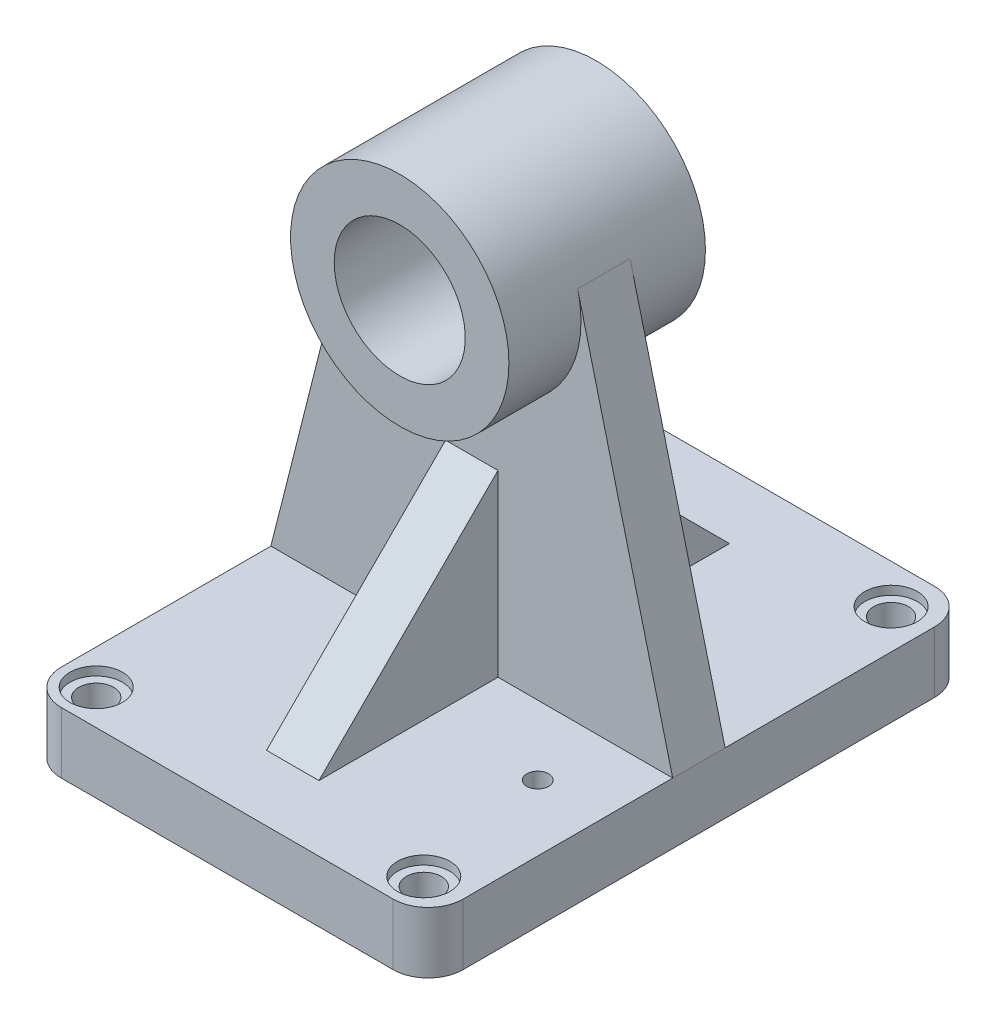
ISO-10303-21;
HEADER;
FILE_DESCRIPTION(('STEP AP214'),'2;1');
FILE_NAME('part.step','',(''),(''),'','','');
FILE_SCHEMA(('AUTOMOTIVE_DESIGN { 1 0 10303 214 1 1 1 1 }'));
ENDSEC;
DATA;
#1=APPLICATION_CONTEXT('core data for automotive mechanical design processes');
#2=APPLICATION_PROTOCOL_DEFINITION('international standard','automotive_design',2000,#1);
#3=PRODUCT_CONTEXT('',#1,'mechanical');
#4=PRODUCT('Part','Part','',(#3));
#5=PRODUCT_RELATED_PRODUCT_CATEGORY('part','',(#4));
#6=PRODUCT_DEFINITION_FORMATION('','',#4);
#7=PRODUCT_DEFINITION_CONTEXT('part definition',#1,'design');
#8=PRODUCT_DEFINITION('design','',#6,#7);
#9=PRODUCT_DEFINITION_SHAPE('','',#8);
#10=(LENGTH_UNIT() NAMED_UNIT(*) SI_UNIT(.MILLI.,.METRE.));
#11=(NAMED_UNIT(*) PLANE_ANGLE_UNIT() SI_UNIT($,.RADIAN.));
#12=(NAMED_UNIT(*) SI_UNIT($,.STERADIAN.) SOLID_ANGLE_UNIT());
#13=UNCERTAINTY_MEASURE_WITH_UNIT(LENGTH_MEASURE(1.E-05),#10,'distance_accuracy_value','');
#14=(GEOMETRIC_REPRESENTATION_CONTEXT(3) GLOBAL_UNCERTAINTY_ASSIGNED_CONTEXT((#13)) GLOBAL_UNIT_ASSIGNED_CONTEXT((#10,
#11,#12)) REPRESENTATION_CONTEXT('',''));
#15=CARTESIAN_POINT('',(0.,0.,0.));
#16=DIRECTION('',(0.,0.,1.));
#17=DIRECTION('',(1.,0.,0.));
#18=AXIS2_PLACEMENT_3D('',#15,#16,#17);
#19=CARTESIAN_POINT('',(-46.,-94.,-62.));
#20=DIRECTION('',(0.,-1.,0.));
#21=DIRECTION('',(0.,0.,-1.));
#22=AXIS2_PLACEMENT_3D('',#19,#20,#21);
#23=PLANE('',#22);
#24=CARTESIAN_POINT('',(37.,-94.,-53.));
#25=DIRECTION('',(0.,1.,0.));
#26=DIRECTION('',(0.,0.,1.));
#27=AXIS2_PLACEMENT_3D('',#24,#25,#26);
#28=CIRCLE('',#27,4.);
#29=CARTESIAN_POINT('',(37.,-94.,-49.));
#30=VERTEX_POINT('',#29);
#31=EDGE_CURVE('E761',#30,#30,#28,.T.);
#32=ORIENTED_EDGE('',*,*,#31,.T.);
#33=EDGE_LOOP('',(#32));
#34=FACE_BOUND('',#33,.T.);
#35=DIRECTION('',(0.,0.,1.));
#36=VECTOR('',#35,1.);
#37=CARTESIAN_POINT('',(-46.,-94.,-62.));
#38=LINE('',#37,#36);
#39=CARTESIAN_POINT('',(-46.,-94.,-54.));
#40=VERTEX_POINT('',#39);
#41=CARTESIAN_POINT('',(-46.,-94.,54.));
#42=VERTEX_POINT('',#41);
#43=EDGE_CURVE('E255',#40,#42,#38,.T.);
#44=ORIENTED_EDGE('',*,*,#43,.F.);
#45=CARTESIAN_POINT('',(-38.,-94.,-54.));
#46=DIRECTION('',(0.,-1.,0.));
#47=DIRECTION('',(0.,0.,-1.));
#48=AXIS2_PLACEMENT_3D('',#45,#46,#47);
#49=CIRCLE('',#48,8.);
#50=CARTESIAN_POINT('',(-38.,-94.,-62.));
#51=VERTEX_POINT('',#50);
#52=EDGE_CURVE('E347',#40,#51,#49,.T.);
#53=ORIENTED_EDGE('',*,*,#52,.T.);
#54=DIRECTION('',(1.,0.,0.));
#55=VECTOR('',#54,1.);
#56=CARTESIAN_POINT('',(-46.,-94.,-62.));
#57=LINE('',#56,#55);
#58=CARTESIAN_POINT('',(38.,-94.,-62.));
#59=VERTEX_POINT('',#58);
#60=EDGE_CURVE('E246',#51,#59,#57,.T.);
#61=ORIENTED_EDGE('',*,*,#60,.T.);
#62=CARTESIAN_POINT('',(38.,-94.,-54.));
#63=DIRECTION('',(0.,-1.,0.));
#64=DIRECTION('',(0.,0.,-1.));
#65=AXIS2_PLACEMENT_3D('',#62,#63,#64);
#66=CIRCLE('',#65,8.);
#67=CARTESIAN_POINT('',(46.,-94.,-54.));
#68=VERTEX_POINT('',#67);
#69=EDGE_CURVE('E344',#59,#68,#66,.T.);
#70=ORIENTED_EDGE('',*,*,#69,.T.);
#71=DIRECTION('',(0.,0.,1.));
#72=VECTOR('',#71,1.);
#73=CARTESIAN_POINT('',(46.,-94.,-62.));
#74=LINE('',#73,#72);
#75=CARTESIAN_POINT('',(46.,-94.,54.));
#76=VERTEX_POINT('',#75);
#77=EDGE_CURVE('E268',#68,#76,#74,.T.);
#78=ORIENTED_EDGE('',*,*,#77,.T.);
#79=CARTESIAN_POINT('',(38.,-94.,54.));
#80=DIRECTION('',(0.,-1.,0.));
#81=DIRECTION('',(0.,0.,-1.));
#82=AXIS2_PLACEMENT_3D('',#79,#80,#81);
#83=CIRCLE('',#82,8.);
#84=CARTESIAN_POINT('',(38.,-94.,62.));
#85=VERTEX_POINT('',#84);
#86=EDGE_CURVE('E341',#76,#85,#83,.T.);
#87=ORIENTED_EDGE('',*,*,#86,.T.);
#88=DIRECTION('',(1.,0.,0.));
#89=VECTOR('',#88,1.);
#90=CARTESIAN_POINT('',(-46.,-94.,62.));
#91=LINE('',#90,#89);
#92=CARTESIAN_POINT('',(-38.,-94.,62.));
#93=VERTEX_POINT('',#92);
#94=EDGE_CURVE('E245',#93,#85,#91,.T.);
#95=ORIENTED_EDGE('',*,*,#94,.F.);
#96=CARTESIAN_POINT('',(-38.,-94.,54.));
#97=DIRECTION('',(0.,-1.,0.));
#98=DIRECTION('',(0.,0.,-1.));
#99=AXIS2_PLACEMENT_3D('',#96,#97,#98);
#100=CIRCLE('',#99,8.);
#101=EDGE_CURVE('E338',#93,#42,#100,.T.);
#102=ORIENTED_EDGE('',*,*,#101,.T.);
#103=EDGE_LOOP('',(#44,#53,#61,#70,#78,#87,#95,#102));
#104=FACE_BOUND('',#103,.T.);
#105=CARTESIAN_POINT('',(-38.,-94.,54.));
#106=DIRECTION('',(0.,1.,0.));
#107=DIRECTION('',(0.,0.,1.));
#108=AXIS2_PLACEMENT_3D('',#105,#106,#107);
#109=CIRCLE('',#108,4.);
#110=CARTESIAN_POINT('',(-38.,-94.,58.));
#111=VERTEX_POINT('',#110);
#112=EDGE_CURVE('E517',#111,#111,#109,.T.);
#113=ORIENTED_EDGE('',*,*,#112,.T.);
#114=EDGE_LOOP('',(#113));
#115=FACE_BOUND('',#114,.T.);
#116=CARTESIAN_POINT('',(30.9432382564792,-94.,21.8439501733275));
#117=DIRECTION('',(0.,1.,0.));
#118=DIRECTION('',(0.,0.,1.));
#119=AXIS2_PLACEMENT_3D('',#116,#117,#118);
#120=CIRCLE('',#119,2.5);
#121=CARTESIAN_POINT('',(30.9432382564792,-94.,24.3439501733275));
#122=VERTEX_POINT('',#121);
#123=EDGE_CURVE('E503',#122,#122,#120,.T.);
#124=ORIENTED_EDGE('',*,*,#123,.T.);
#125=EDGE_LOOP('',(#124));
#126=FACE_BOUND('',#125,.T.);
#127=CARTESIAN_POINT('',(-38.,-94.,-53.));
#128=DIRECTION('',(0.,1.,0.));
#129=DIRECTION('',(0.,0.,1.));
#130=AXIS2_PLACEMENT_3D('',#127,#128,#129);
#131=CIRCLE('',#130,4.);
#132=CARTESIAN_POINT('',(-38.,-94.,-49.));
#133=VERTEX_POINT('',#132);
#134=EDGE_CURVE('E790',#133,#133,#131,.T.);
#135=ORIENTED_EDGE('',*,*,#134,.T.);
#136=EDGE_LOOP('',(#135));
#137=FACE_BOUND('',#136,.T.);
#138=CARTESIAN_POINT('',(37.,-94.,54.));
#139=DIRECTION('',(0.,1.,0.));
#140=DIRECTION('',(0.,0.,1.));
#141=AXIS2_PLACEMENT_3D('',#138,#139,#140);
#142=CIRCLE('',#141,4.);
#143=CARTESIAN_POINT('',(37.,-94.,58.));
#144=VERTEX_POINT('',#143);
#145=EDGE_CURVE('E774',#144,#144,#142,.T.);
#146=ORIENTED_EDGE('',*,*,#145,.T.);
#147=EDGE_LOOP('',(#146));
#148=FACE_BOUND('',#147,.T.);
#149=ADVANCED_FACE('F43',(#34,#104,#115,#126,#137,#148),#23,.T.);
#150=CARTESIAN_POINT('',(0.,0.,22.5));
#151=DIRECTION('',(0.,0.,1.));
#152=DIRECTION('',(1.,0.,0.));
#153=AXIS2_PLACEMENT_3D('',#150,#151,#152);
#154=PLANE('',#153);
#155=CARTESIAN_POINT('',(0.,0.,22.5));
#156=DIRECTION('',(0.,0.,1.));
#157=DIRECTION('',(1.,0.,0.));
#158=AXIS2_PLACEMENT_3D('',#155,#156,#157);
#159=CIRCLE('',#158,15.);
#160=CARTESIAN_POINT('',(-15.,0.,22.5));
#161=VERTEX_POINT('',#160);
#162=EDGE_CURVE('E316',#161,#161,#159,.T.);
#163=ORIENTED_EDGE('',*,*,#162,.F.);
#164=EDGE_LOOP('',(#163));
#165=FACE_BOUND('',#164,.T.);
#166=CARTESIAN_POINT('',(0.,0.,22.5));
#167=DIRECTION('',(0.,0.,1.));
#168=DIRECTION('',(1.,0.,0.));
#169=AXIS2_PLACEMENT_3D('',#166,#167,#168);
#170=CIRCLE('',#169,25.);
#171=CARTESIAN_POINT('',(25.,0.,22.5));
#172=VERTEX_POINT('',#171);
#173=EDGE_CURVE('E324',#172,#172,#170,.T.);
#174=ORIENTED_EDGE('',*,*,#173,.T.);
#175=EDGE_LOOP('',(#174));
#176=FACE_BOUND('',#175,.T.);
#177=ADVANCED_FACE('F457',(#165,#176),#154,.T.);
#178=CARTESIAN_POINT('',(0.,0.,-22.5));
#179=DIRECTION('',(0.,0.,1.));
#180=DIRECTION('',(1.,0.,0.));
#181=AXIS2_PLACEMENT_3D('',#178,#179,#180);
#182=PLANE('',#181);
#183=CARTESIAN_POINT('',(0.,0.,-22.5));
#184=DIRECTION('',(0.,0.,1.));
#185=DIRECTION('',(1.,0.,0.));
#186=AXIS2_PLACEMENT_3D('',#183,#184,#185);
#187=CIRCLE('',#186,15.);
#188=CARTESIAN_POINT('',(-15.,0.,-22.5));
#189=VERTEX_POINT('',#188);
#190=EDGE_CURVE('E315',#189,#189,#187,.T.);
#191=ORIENTED_EDGE('',*,*,#190,.T.);
#192=EDGE_LOOP('',(#191));
#193=FACE_BOUND('',#192,.T.);
#194=CARTESIAN_POINT('',(0.,0.,-22.5));
#195=DIRECTION('',(0.,0.,1.));
#196=DIRECTION('',(1.,0.,0.));
#197=AXIS2_PLACEMENT_3D('',#194,#195,#196);
#198=CIRCLE('',#197,25.);
#199=CARTESIAN_POINT('',(25.,0.,-22.5));
#200=VERTEX_POINT('',#199);
#201=EDGE_CURVE('E320',#200,#200,#198,.T.);
#202=ORIENTED_EDGE('',*,*,#201,.F.);
#203=EDGE_LOOP('',(#202));
#204=FACE_BOUND('',#203,.T.);
#205=ADVANCED_FACE('F463',(#193,#204),#182,.F.);
#206=CARTESIAN_POINT('',(0.,0.,22.5));
#207=DIRECTION('',(0.,0.,-1.));
#208=DIRECTION('',(-1.,0.,0.));
#209=AXIS2_PLACEMENT_3D('',#206,#207,#208);
#210=CYLINDRICAL_SURFACE('',#209,25.);
#211=ORIENTED_EDGE('',*,*,#201,.T.);
#212=EDGE_LOOP('',(#211));
#213=FACE_BOUND('',#212,.T.);
#214=DIRECTION('',(0.,0.,-1.));
#215=VECTOR('',#214,1.);
#216=CARTESIAN_POINT('',(-24.2382106129064,6.12447110242117,6.));
#217=LINE('',#216,#215);
#218=CARTESIAN_POINT('',(-24.2382106129064,6.12447110242118,6.00000000000001));
#219=VERTEX_POINT('',#218);
#220=CARTESIAN_POINT('',(-24.2382106129064,6.12447110242117,-6.));
#221=VERTEX_POINT('',#220);
#222=EDGE_CURVE('E311',#219,#221,#217,.T.);
#223=ORIENTED_EDGE('',*,*,#222,.F.);
#224=CARTESIAN_POINT('',(0.,0.,6.));
#225=DIRECTION('',(0.,0.,-1.));
#226=DIRECTION('',(1.,0.,0.));
#227=AXIS2_PLACEMENT_3D('',#224,#225,#226);
#228=CIRCLE('',#227,25.);
#229=CARTESIAN_POINT('',(24.2382106129064,6.12447110242118,6.00000000000001));
#230=VERTEX_POINT('',#229);
#231=EDGE_CURVE('E275',#230,#219,#228,.T.);
#232=ORIENTED_EDGE('',*,*,#231,.F.);
#233=DIRECTION('',(0.,0.,-1.));
#234=VECTOR('',#233,1.);
#235=CARTESIAN_POINT('',(24.2382106129064,6.12447110242117,6.));
#236=LINE('',#235,#234);
#237=CARTESIAN_POINT('',(24.2382106129064,6.12447110242117,-6.));
#238=VERTEX_POINT('',#237);
#239=EDGE_CURVE('E292',#230,#238,#236,.T.);
#240=ORIENTED_EDGE('',*,*,#239,.T.);
#241=CARTESIAN_POINT('',(0.,0.,-6.));
#242=DIRECTION('',(0.,0.,-1.));
#243=DIRECTION('',(1.,0.,0.));
#244=AXIS2_PLACEMENT_3D('',#241,#242,#243);
#245=CIRCLE('',#244,25.);
#246=EDGE_CURVE('E262',#238,#221,#245,.T.);
#247=ORIENTED_EDGE('',*,*,#246,.T.);
#248=EDGE_LOOP('',(#223,#232,#240,#247));
#249=FACE_BOUND('',#248,.T.);
#250=ORIENTED_EDGE('',*,*,#173,.F.);
#251=EDGE_LOOP('',(#250));
#252=FACE_BOUND('',#251,.T.);
#253=ADVANCED_FACE('F426',(#213,#249,#252),#210,.T.);
#254=CARTESIAN_POINT('',(0.,0.,22.5));
#255=DIRECTION('',(0.,0.,-1.));
#256=DIRECTION('',(-1.,0.,0.));
#257=AXIS2_PLACEMENT_3D('',#254,#255,#256);
#258=CYLINDRICAL_SURFACE('',#257,15.);
#259=CARTESIAN_POINT('',(-15.,0.,22.5));
#260=CARTESIAN_POINT('',(-15.,0.,22.03125));
#261=CARTESIAN_POINT('',(-15.,0.,21.5625));
#262=CARTESIAN_POINT('',(-15.,0.,20.625));
#263=CARTESIAN_POINT('',(-15.,0.,20.15625));
#264=CARTESIAN_POINT('',(-15.,0.,19.21875));
#265=CARTESIAN_POINT('',(-15.,0.,18.75));
#266=CARTESIAN_POINT('',(-15.,0.,17.8125));
#267=CARTESIAN_POINT('',(-15.,0.,17.34375));
#268=CARTESIAN_POINT('',(-15.,0.,16.40625));
#269=CARTESIAN_POINT('',(-15.,0.,15.9375));
#270=CARTESIAN_POINT('',(-15.,0.,15.));
#271=CARTESIAN_POINT('',(-15.,0.,14.53125));
#272=CARTESIAN_POINT('',(-15.,0.,13.59375));
#273=CARTESIAN_POINT('',(-15.,0.,13.125));
#274=CARTESIAN_POINT('',(-15.,0.,12.1875));
#275=CARTESIAN_POINT('',(-15.,0.,11.71875));
#276=CARTESIAN_POINT('',(-15.,0.,10.78125));
#277=CARTESIAN_POINT('',(-15.,0.,10.3125));
#278=CARTESIAN_POINT('',(-15.,0.,9.37499999999999));
#279=CARTESIAN_POINT('',(-15.,0.,8.90625));
#280=CARTESIAN_POINT('',(-15.,0.,7.96874999999999));
#281=CARTESIAN_POINT('',(-15.,0.,7.5));
#282=CARTESIAN_POINT('',(-15.,0.,6.5625));
#283=CARTESIAN_POINT('',(-15.,0.,6.09375));
#284=CARTESIAN_POINT('',(-15.,0.,5.15625));
#285=CARTESIAN_POINT('',(-15.,0.,4.6875));
#286=CARTESIAN_POINT('',(-15.,0.,3.75));
#287=CARTESIAN_POINT('',(-15.,0.,3.28125));
#288=CARTESIAN_POINT('',(-15.,0.,2.34375));
#289=CARTESIAN_POINT('',(-15.,0.,1.875));
#290=CARTESIAN_POINT('',(-15.,0.,0.937499999999997));
#291=CARTESIAN_POINT('',(-15.,0.,0.468749999999997));
#292=CARTESIAN_POINT('',(-15.,0.,-0.468750000000004));
#293=CARTESIAN_POINT('',(-15.,0.,-0.937500000000004));
#294=CARTESIAN_POINT('',(-15.,0.,-1.87500000000001));
#295=CARTESIAN_POINT('',(-15.,0.,-2.34375000000001));
#296=CARTESIAN_POINT('',(-15.,0.,-3.28125));
#297=CARTESIAN_POINT('',(-15.,0.,-3.75));
#298=CARTESIAN_POINT('',(-15.,0.,-4.6875));
#299=CARTESIAN_POINT('',(-15.,0.,-5.15625));
#300=CARTESIAN_POINT('',(-15.,0.,-6.09375000000001));
#301=CARTESIAN_POINT('',(-15.,0.,-6.56250000000001));
#302=CARTESIAN_POINT('',(-15.,0.,-7.50000000000001));
#303=CARTESIAN_POINT('',(-15.,0.,-7.96875000000001));
#304=CARTESIAN_POINT('',(-15.,0.,-8.90625));
#305=CARTESIAN_POINT('',(-15.,0.,-9.37500000000001));
#306=CARTESIAN_POINT('',(-15.,0.,-10.3125));
#307=CARTESIAN_POINT('',(-15.,0.,-10.78125));
#308=CARTESIAN_POINT('',(-15.,0.,-11.71875));
#309=CARTESIAN_POINT('',(-15.,0.,-12.1875));
#310=CARTESIAN_POINT('',(-15.,0.,-13.125));
#311=CARTESIAN_POINT('',(-15.,0.,-13.59375));
#312=CARTESIAN_POINT('',(-15.,0.,-14.53125));
#313=CARTESIAN_POINT('',(-15.,0.,-15.));
#314=CARTESIAN_POINT('',(-15.,0.,-15.9375));
#315=CARTESIAN_POINT('',(-15.,0.,-16.40625));
#316=CARTESIAN_POINT('',(-15.,0.,-17.34375));
#317=CARTESIAN_POINT('',(-15.,0.,-17.8125));
#318=CARTESIAN_POINT('',(-15.,0.,-18.75));
#319=CARTESIAN_POINT('',(-15.,0.,-19.21875));
#320=CARTESIAN_POINT('',(-15.,0.,-20.15625));
#321=CARTESIAN_POINT('',(-15.,0.,-20.625));
#322=CARTESIAN_POINT('',(-15.,0.,-21.5625));
#323=CARTESIAN_POINT('',(-15.,0.,-22.03125));
#324=CARTESIAN_POINT('',(-15.,0.,-22.5));
#325=B_SPLINE_CURVE_WITH_KNOTS('',3,(#259,#260,#261,#262,#263,#264,#265,#266,#267,#268,#269,
#270,#271,#272,#273,#274,#275,#276,#277,#278,#279,#280,#281,#282,#283,#284,#285,#286,#287,#288,
#289,#290,#291,#292,#293,#294,#295,#296,#297,#298,#299,#300,#301,#302,#303,#304,#305,#306,#307,
#308,#309,#310,#311,#312,#313,#314,#315,#316,#317,#318,#319,#320,#321,#322,#323,#324),
.UNSPECIFIED.,.F.,.F.,(4,2,2,2,2,2,2,2,2,2,2,2,2,2,2,2,2,2,2,2,2,2,2,2,2,2,2,2,2,2,2,2,4),(0.,
1.40625,2.8125,4.21875,5.625,7.03125,8.4375,9.84375,11.25,12.65625,14.0625,15.46875,16.875,
18.28125,19.6875,21.09375,22.5,23.90625,25.3125,26.71875,28.125,29.53125,30.9375,32.34375,33.75,
35.15625,36.5625,37.96875,39.375,40.78125,42.1875,43.59375,45.),.UNSPECIFIED.);
#326=EDGE_CURVE('BSEAM447',#161,#189,#325,.T.);
#327=ORIENTED_EDGE('',*,*,#162,.T.);
#328=ORIENTED_EDGE('',*,*,#190,.F.);
#329=ORIENTED_EDGE('',*,*,#326,.T.);
#330=ORIENTED_EDGE('',*,*,#326,.F.);
#331=EDGE_LOOP('',(#327,#329,#328,#330));
#332=FACE_BOUND('',#331,.T.);
#333=ADVANCED_FACE('F447',(#332),#258,.F.);
#334=CARTESIAN_POINT('',(-24.2382106129064,6.12447110242117,6.));
#335=DIRECTION('',(0.969528424516256,-0.244978844096847,0.));
#336=DIRECTION('',(0.244978844096847,0.969528424516256,0.));
#337=AXIS2_PLACEMENT_3D('',#334,#335,#336);
#338=PLANE('',#337);
#339=DIRECTION('',(-0.244978844096847,-0.969528424516256,0.));
#340=VECTOR('',#339,1.);
#341=CARTESIAN_POINT('',(-24.2382106129064,6.12447110242117,-6.));
#342=LINE('',#341,#340);
#343=CARTESIAN_POINT('',(-46.,-80.,-6.));
#344=VERTEX_POINT('',#343);
#345=EDGE_CURVE('E295',#221,#344,#342,.T.);
#346=ORIENTED_EDGE('',*,*,#345,.T.);
#347=DIRECTION('',(0.,0.,-1.));
#348=VECTOR('',#347,1.);
#349=CARTESIAN_POINT('',(-46.,-80.,6.));
#350=LINE('',#349,#348);
#351=CARTESIAN_POINT('',(-46.,-80.,6.00000000000001));
#352=VERTEX_POINT('',#351);
#353=EDGE_CURVE('E308',#352,#344,#350,.T.);
#354=ORIENTED_EDGE('',*,*,#353,.F.);
#355=DIRECTION('',(-0.244978844096847,-0.969528424516256,0.));
#356=VECTOR('',#355,1.);
#357=CARTESIAN_POINT('',(-24.2382106129064,6.12447110242117,6.));
#358=LINE('',#357,#356);
#359=EDGE_CURVE('E279',#219,#352,#358,.T.);
#360=ORIENTED_EDGE('',*,*,#359,.F.);
#361=ORIENTED_EDGE('',*,*,#222,.T.);
#362=EDGE_LOOP('',(#346,#354,#360,#361));
#363=FACE_BOUND('',#362,.T.);
#364=ADVANCED_FACE('F445',(#363),#338,.F.);
#365=CARTESIAN_POINT('',(24.2382106129064,6.12447110242117,6.));
#366=DIRECTION('',(-0.969528424516256,-0.244978844096847,0.));
#367=DIRECTION('',(0.244978844096847,-0.969528424516256,0.));
#368=AXIS2_PLACEMENT_3D('',#365,#366,#367);
#369=PLANE('',#368);
#370=DIRECTION('',(-0.244978844096847,0.969528424516256,0.));
#371=VECTOR('',#370,1.);
#372=CARTESIAN_POINT('',(24.2382106129064,6.12447110242117,-6.));
#373=LINE('',#372,#371);
#374=CARTESIAN_POINT('',(46.,-80.,-6.));
#375=VERTEX_POINT('',#374);
#376=EDGE_CURVE('E181',#375,#238,#373,.T.);
#377=ORIENTED_EDGE('',*,*,#376,.T.);
#378=ORIENTED_EDGE('',*,*,#239,.F.);
#379=DIRECTION('',(-0.244978844096847,0.969528424516256,0.));
#380=VECTOR('',#379,1.);
#381=CARTESIAN_POINT('',(24.2382106129064,6.12447110242117,6.));
#382=LINE('',#381,#380);
#383=CARTESIAN_POINT('',(46.,-80.,6.));
#384=VERTEX_POINT('',#383);
#385=EDGE_CURVE('E288',#384,#230,#382,.T.);
#386=ORIENTED_EDGE('',*,*,#385,.F.);
#387=DIRECTION('',(0.,0.,-1.));
#388=VECTOR('',#387,1.);
#389=CARTESIAN_POINT('',(46.,-80.,6.));
#390=LINE('',#389,#388);
#391=EDGE_CURVE('E304',#384,#375,#390,.T.);
#392=ORIENTED_EDGE('',*,*,#391,.T.);
#393=EDGE_LOOP('',(#377,#378,#386,#392));
#394=FACE_BOUND('',#393,.T.);
#395=ADVANCED_FACE('F422',(#394),#369,.F.);
#396=CARTESIAN_POINT('',(0.,0.,6.));
#397=DIRECTION('',(0.,0.,1.));
#398=DIRECTION('',(1.,0.,0.));
#399=AXIS2_PLACEMENT_3D('',#396,#397,#398);
#400=PLANE('',#399);
#401=DIRECTION('',(-1.,0.,0.));
#402=VECTOR('',#401,1.);
#403=CARTESIAN_POINT('',(0.,-38.9999999999998,6.));
#404=LINE('',#403,#402);
#405=CARTESIAN_POINT('',(6.,-38.9999999999998,6.));
#406=VERTEX_POINT('',#405);
#407=CARTESIAN_POINT('',(-6.,-38.9999999999998,6.));
#408=VERTEX_POINT('',#407);
#409=EDGE_CURVE('E241',#406,#408,#404,.T.);
#410=ORIENTED_EDGE('',*,*,#409,.F.);
#411=DIRECTION('',(0.,1.,0.));
#412=VECTOR('',#411,1.);
#413=CARTESIAN_POINT('',(6.,0.,6.));
#414=LINE('',#413,#412);
#415=CARTESIAN_POINT('',(6.,-80.,6.));
#416=VERTEX_POINT('',#415);
#417=EDGE_CURVE('E234',#416,#406,#414,.T.);
#418=ORIENTED_EDGE('',*,*,#417,.F.);
#419=DIRECTION('',(1.,0.,0.));
#420=VECTOR('',#419,1.);
#421=CARTESIAN_POINT('',(-46.,-80.,6.));
#422=LINE('',#421,#420);
#423=EDGE_CURVE('E283',#416,#384,#422,.T.);
#424=ORIENTED_EDGE('',*,*,#423,.T.);
#425=ORIENTED_EDGE('',*,*,#385,.T.);
#426=ORIENTED_EDGE('',*,*,#231,.T.);
#427=ORIENTED_EDGE('',*,*,#359,.T.);
#428=CARTESIAN_POINT('',(-6.,-80.,6.));
#429=VERTEX_POINT('',#428);
#430=EDGE_CURVE('E284',#352,#429,#422,.T.);
#431=ORIENTED_EDGE('',*,*,#430,.T.);
#432=DIRECTION('',(0.,1.,0.));
#433=VECTOR('',#432,1.);
#434=CARTESIAN_POINT('',(-6.,0.,6.));
#435=LINE('',#434,#433);
#436=EDGE_CURVE('E228',#429,#408,#435,.T.);
#437=ORIENTED_EDGE('',*,*,#436,.T.);
#438=EDGE_LOOP('',(#410,#418,#424,#425,#426,#427,#431,#437));
#439=FACE_BOUND('',#438,.T.);
#440=ADVANCED_FACE('F430',(#439),#400,.T.);
#441=CARTESIAN_POINT('',(0.,0.,-6.));
#442=DIRECTION('',(0.,0.,1.));
#443=DIRECTION('',(1.,0.,0.));
#444=AXIS2_PLACEMENT_3D('',#441,#442,#443);
#445=PLANE('',#444);
#446=DIRECTION('',(1.,0.,0.));
#447=VECTOR('',#446,1.);
#448=CARTESIAN_POINT('',(-46.,-80.,-6.));
#449=LINE('',#448,#447);
#450=CARTESIAN_POINT('',(6.,-80.,-6.));
#451=VERTEX_POINT('',#450);
#452=EDGE_CURVE('E182',#451,#375,#449,.T.);
#453=ORIENTED_EDGE('',*,*,#452,.F.);
#454=DIRECTION('',(0.,1.,0.));
#455=VECTOR('',#454,1.);
#456=CARTESIAN_POINT('',(6.,0.,-6.));
#457=LINE('',#456,#455);
#458=CARTESIAN_POINT('',(6.,-38.9999999999998,-6.));
#459=VERTEX_POINT('',#458);
#460=EDGE_CURVE('E208',#451,#459,#457,.T.);
#461=ORIENTED_EDGE('',*,*,#460,.T.);
#462=DIRECTION('',(1.,0.,0.));
#463=VECTOR('',#462,1.);
#464=CARTESIAN_POINT('',(0.,-38.9999999999998,-6.));
#465=LINE('',#464,#463);
#466=CARTESIAN_POINT('',(-6.,-38.9999999999998,-6.));
#467=VERTEX_POINT('',#466);
#468=EDGE_CURVE('E189',#459,#467,#465,.F.);
#469=ORIENTED_EDGE('',*,*,#468,.T.);
#470=DIRECTION('',(0.,1.,0.));
#471=VECTOR('',#470,1.);
#472=CARTESIAN_POINT('',(-6.,0.,-6.));
#473=LINE('',#472,#471);
#474=CARTESIAN_POINT('',(-6.,-80.,-6.));
#475=VERTEX_POINT('',#474);
#476=EDGE_CURVE('E185',#475,#467,#473,.T.);
#477=ORIENTED_EDGE('',*,*,#476,.F.);
#478=EDGE_CURVE('E168',#344,#475,#449,.T.);
#479=ORIENTED_EDGE('',*,*,#478,.F.);
#480=ORIENTED_EDGE('',*,*,#345,.F.);
#481=ORIENTED_EDGE('',*,*,#246,.F.);
#482=ORIENTED_EDGE('',*,*,#376,.F.);
#483=EDGE_LOOP('',(#453,#461,#469,#477,#479,#480,#481,#482));
#484=FACE_BOUND('',#483,.T.);
#485=ADVANCED_FACE('F187',(#484),#445,.F.);
#486=CARTESIAN_POINT('',(-46.,-80.,-62.));
#487=DIRECTION('',(0.,-1.,0.));
#488=DIRECTION('',(0.,0.,-1.));
#489=AXIS2_PLACEMENT_3D('',#486,#487,#488);
#490=PLANE('',#489);
#491=CARTESIAN_POINT('',(37.,-80.,-53.));
#492=DIRECTION('',(0.,1.,0.));
#493=DIRECTION('',(0.,0.,1.));
#494=AXIS2_PLACEMENT_3D('',#491,#492,#493);
#495=CIRCLE('',#494,6.);
#496=CARTESIAN_POINT('',(37.,-80.,-47.));
#497=VERTEX_POINT('',#496);
#498=EDGE_CURVE('E751',#497,#497,#495,.T.);
#499=ORIENTED_EDGE('',*,*,#498,.F.);
#500=EDGE_LOOP('',(#499));
#501=FACE_BOUND('',#500,.T.);
#502=CARTESIAN_POINT('',(-38.,-80.,-53.));
#503=DIRECTION('',(0.,1.,0.));
#504=DIRECTION('',(0.,0.,1.));
#505=AXIS2_PLACEMENT_3D('',#502,#503,#504);
#506=CIRCLE('',#505,6.);
#507=CARTESIAN_POINT('',(-38.,-80.,-47.));
#508=VERTEX_POINT('',#507);
#509=EDGE_CURVE('E778',#508,#508,#506,.T.);
#510=ORIENTED_EDGE('',*,*,#509,.F.);
#511=EDGE_LOOP('',(#510));
#512=FACE_BOUND('',#511,.T.);
#513=DIRECTION('',(1.,0.,0.));
#514=VECTOR('',#513,1.);
#515=CARTESIAN_POINT('',(-46.,-80.,-62.));
#516=LINE('',#515,#514);
#517=CARTESIAN_POINT('',(-38.,-80.,-62.));
#518=VERTEX_POINT('',#517);
#519=CARTESIAN_POINT('',(38.,-80.,-62.));
#520=VERTEX_POINT('',#519);
#521=EDGE_CURVE('E250',#518,#520,#516,.T.);
#522=ORIENTED_EDGE('',*,*,#521,.F.);
#523=CARTESIAN_POINT('',(-38.,-80.,-54.));
#524=DIRECTION('',(0.,-1.,0.));
#525=DIRECTION('',(0.,0.,-1.));
#526=AXIS2_PLACEMENT_3D('',#523,#524,#525);
#527=CIRCLE('',#526,8.);
#528=CARTESIAN_POINT('',(-46.,-80.,-54.));
#529=VERTEX_POINT('',#528);
#530=EDGE_CURVE('E360',#518,#529,#527,.F.);
#531=ORIENTED_EDGE('',*,*,#530,.T.);
#532=DIRECTION('',(0.,0.,1.));
#533=VECTOR('',#532,1.);
#534=CARTESIAN_POINT('',(-46.,-80.,-62.));
#535=LINE('',#534,#533);
#536=EDGE_CURVE('E176',#529,#344,#535,.T.);
#537=ORIENTED_EDGE('',*,*,#536,.T.);
#538=ORIENTED_EDGE('',*,*,#478,.T.);
#539=DIRECTION('',(0.,0.,1.));
#540=VECTOR('',#539,1.);
#541=CARTESIAN_POINT('',(-6.,-80.,-62.));
#542=LINE('',#541,#540);
#543=CARTESIAN_POINT('',(-6.,-80.,-47.));
#544=VERTEX_POINT('',#543);
#545=EDGE_CURVE('E173',#544,#475,#542,.T.);
#546=ORIENTED_EDGE('',*,*,#545,.F.);
#547=DIRECTION('',(-1.,0.,0.));
#548=VECTOR('',#547,1.);
#549=CARTESIAN_POINT('',(-46.,-80.,-47.));
#550=LINE('',#549,#548);
#551=CARTESIAN_POINT('',(6.,-80.,-47.));
#552=VERTEX_POINT('',#551);
#553=EDGE_CURVE('E211',#544,#552,#550,.F.);
#554=ORIENTED_EDGE('',*,*,#553,.T.);
#555=DIRECTION('',(0.,0.,1.));
#556=VECTOR('',#555,1.);
#557=CARTESIAN_POINT('',(6.,-80.,-62.));
#558=LINE('',#557,#556);
#559=EDGE_CURVE('E194',#552,#451,#558,.T.);
#560=ORIENTED_EDGE('',*,*,#559,.T.);
#561=ORIENTED_EDGE('',*,*,#452,.T.);
#562=DIRECTION('',(0.,0.,1.));
#563=VECTOR('',#562,1.);
#564=CARTESIAN_POINT('',(46.,-80.,-62.));
#565=LINE('',#564,#563);
#566=CARTESIAN_POINT('',(46.,-80.,-54.));
#567=VERTEX_POINT('',#566);
#568=EDGE_CURVE('E264',#567,#375,#565,.T.);
#569=ORIENTED_EDGE('',*,*,#568,.F.);
#570=CARTESIAN_POINT('',(38.,-80.,-54.));
#571=DIRECTION('',(0.,-1.,0.));
#572=DIRECTION('',(0.,0.,-1.));
#573=AXIS2_PLACEMENT_3D('',#570,#571,#572);
#574=CIRCLE('',#573,8.);
#575=EDGE_CURVE('E357',#567,#520,#574,.F.);
#576=ORIENTED_EDGE('',*,*,#575,.T.);
#577=EDGE_LOOP('',(#522,#531,#537,#538,#546,#554,#560,#561,#569,#576));
#578=FACE_BOUND('',#577,.T.);
#579=ADVANCED_FACE('F171',(#501,#512,#578),#490,.F.);
#580=CARTESIAN_POINT('',(-46.,-80.,-62.));
#581=DIRECTION('',(-1.,0.,0.));
#582=DIRECTION('',(0.,0.,1.));
#583=AXIS2_PLACEMENT_3D('',#580,#581,#582);
#584=PLANE('',#583);
#585=ORIENTED_EDGE('',*,*,#536,.F.);
#586=DIRECTION('',(0.,-1.,0.));
#587=VECTOR('',#586,1.);
#588=CARTESIAN_POINT('',(-46.,-94.,-54.));
#589=LINE('',#588,#587);
#590=EDGE_CURVE('E334',#529,#40,#589,.T.);
#591=ORIENTED_EDGE('',*,*,#590,.T.);
#592=ORIENTED_EDGE('',*,*,#43,.T.);
#593=DIRECTION('',(0.,-1.,0.));
#594=VECTOR('',#593,1.);
#595=CARTESIAN_POINT('',(-46.,-80.,54.));
#596=LINE('',#595,#594);
#597=CARTESIAN_POINT('',(-46.,-80.,54.));
#598=VERTEX_POINT('',#597);
#599=EDGE_CURVE('E328',#42,#598,#596,.F.);
#600=ORIENTED_EDGE('',*,*,#599,.T.);
#601=EDGE_CURVE('E263',#352,#598,#535,.T.);
#602=ORIENTED_EDGE('',*,*,#601,.F.);
#603=ORIENTED_EDGE('',*,*,#353,.T.);
#604=EDGE_LOOP('',(#585,#591,#592,#600,#602,#603));
#605=FACE_BOUND('',#604,.T.);
#606=ADVANCED_FACE('F402',(#605),#584,.T.);
#607=CARTESIAN_POINT('',(37.,-80.,54.));
#608=DIRECTION('',(0.,1.,0.));
#609=DIRECTION('',(0.,0.,1.));
#610=AXIS2_PLACEMENT_3D('',#607,#608,#609);
#611=CIRCLE('',#610,6.);
#612=CARTESIAN_POINT('',(37.,-80.,60.));
#613=VERTEX_POINT('',#612);
#614=EDGE_CURVE('E492',#613,#613,#611,.T.);
#615=ORIENTED_EDGE('',*,*,#614,.F.);
#616=EDGE_LOOP('',(#615));
#617=FACE_BOUND('',#616,.T.);
#618=CARTESIAN_POINT('',(30.9432382564792,-80.,21.8439501733275));
#619=DIRECTION('',(0.,1.,0.));
#620=DIRECTION('',(0.,0.,1.));
#621=AXIS2_PLACEMENT_3D('',#618,#619,#620);
#622=CIRCLE('',#621,2.5);
#623=CARTESIAN_POINT('',(30.9432382564792,-80.,24.3439501733275));
#624=VERTEX_POINT('',#623);
#625=EDGE_CURVE('E496',#624,#624,#622,.T.);
#626=ORIENTED_EDGE('',*,*,#625,.F.);
#627=EDGE_LOOP('',(#626));
#628=FACE_BOUND('',#627,.T.);
#629=CARTESIAN_POINT('',(-38.,-80.,54.));
#630=DIRECTION('',(0.,1.,0.));
#631=DIRECTION('',(0.,0.,1.));
#632=AXIS2_PLACEMENT_3D('',#629,#630,#631);
#633=CIRCLE('',#632,6.);
#634=CARTESIAN_POINT('',(-38.,-80.,60.));
#635=VERTEX_POINT('',#634);
#636=EDGE_CURVE('E499',#635,#635,#633,.T.);
#637=ORIENTED_EDGE('',*,*,#636,.F.);
#638=EDGE_LOOP('',(#637));
#639=FACE_BOUND('',#638,.T.);
#640=DIRECTION('',(1.,0.,0.));
#641=VECTOR('',#640,1.);
#642=CARTESIAN_POINT('',(-46.,-80.,62.));
#643=LINE('',#642,#641);
#644=CARTESIAN_POINT('',(-38.,-80.,62.));
#645=VERTEX_POINT('',#644);
#646=CARTESIAN_POINT('',(38.,-80.,62.));
#647=VERTEX_POINT('',#646);
#648=EDGE_CURVE('E251',#645,#647,#643,.T.);
#649=ORIENTED_EDGE('',*,*,#648,.T.);
#650=CARTESIAN_POINT('',(38.,-80.,54.));
#651=DIRECTION('',(0.,-1.,0.));
#652=DIRECTION('',(0.,0.,-1.));
#653=AXIS2_PLACEMENT_3D('',#650,#651,#652);
#654=CIRCLE('',#653,8.);
#655=CARTESIAN_POINT('',(46.,-80.,54.));
#656=VERTEX_POINT('',#655);
#657=EDGE_CURVE('E11',#647,#656,#654,.F.);
#658=ORIENTED_EDGE('',*,*,#657,.T.);
#659=EDGE_CURVE('E267',#384,#656,#565,.T.);
#660=ORIENTED_EDGE('',*,*,#659,.F.);
#661=ORIENTED_EDGE('',*,*,#423,.F.);
#662=DIRECTION('',(0.,0.,1.));
#663=VECTOR('',#662,1.);
#664=CARTESIAN_POINT('',(6.,-80.,-62.));
#665=LINE('',#664,#663);
#666=CARTESIAN_POINT('',(6.,-80.,47.));
#667=VERTEX_POINT('',#666);
#668=EDGE_CURVE('E231',#416,#667,#665,.T.);
#669=ORIENTED_EDGE('',*,*,#668,.T.);
#670=DIRECTION('',(-1.,0.,0.));
#671=VECTOR('',#670,1.);
#672=CARTESIAN_POINT('',(-46.,-80.,47.));
#673=LINE('',#672,#671);
#674=CARTESIAN_POINT('',(-6.,-80.,47.));
#675=VERTEX_POINT('',#674);
#676=EDGE_CURVE('E238',#667,#675,#673,.T.);
#677=ORIENTED_EDGE('',*,*,#676,.T.);
#678=DIRECTION('',(0.,0.,1.));
#679=VECTOR('',#678,1.);
#680=CARTESIAN_POINT('',(-6.,-80.,-62.));
#681=LINE('',#680,#679);
#682=EDGE_CURVE('E221',#429,#675,#681,.T.);
#683=ORIENTED_EDGE('',*,*,#682,.F.);
#684=ORIENTED_EDGE('',*,*,#430,.F.);
#685=ORIENTED_EDGE('',*,*,#601,.T.);
#686=CARTESIAN_POINT('',(-38.,-80.,54.));
#687=DIRECTION('',(0.,-1.,0.));
#688=DIRECTION('',(0.,0.,-1.));
#689=AXIS2_PLACEMENT_3D('',#686,#687,#688);
#690=CIRCLE('',#689,8.);
#691=EDGE_CURVE('E52',#598,#645,#690,.F.);
#692=ORIENTED_EDGE('',*,*,#691,.T.);
#693=EDGE_LOOP('',(#649,#658,#660,#661,#669,#677,#683,#684,#685,#692));
#694=FACE_BOUND('',#693,.T.);
#695=ADVANCED_FACE('F432',(#617,#628,#639,#694),#490,.F.);
#696=CARTESIAN_POINT('',(46.,-80.,-62.));
#697=DIRECTION('',(-1.,0.,0.));
#698=DIRECTION('',(0.,0.,1.));
#699=AXIS2_PLACEMENT_3D('',#696,#697,#698);
#700=PLANE('',#699);
#701=ORIENTED_EDGE('',*,*,#77,.F.);
#702=DIRECTION('',(0.,-1.,0.));
#703=VECTOR('',#702,1.);
#704=CARTESIAN_POINT('',(46.,-80.,-54.));
#705=LINE('',#704,#703);
#706=EDGE_CURVE('E367',#68,#567,#705,.F.);
#707=ORIENTED_EDGE('',*,*,#706,.T.);
#708=ORIENTED_EDGE('',*,*,#568,.T.);
#709=ORIENTED_EDGE('',*,*,#391,.F.);
#710=ORIENTED_EDGE('',*,*,#659,.T.);
#711=DIRECTION('',(0.,-1.,0.));
#712=VECTOR('',#711,1.);
#713=CARTESIAN_POINT('',(46.,-94.,54.));
#714=LINE('',#713,#712);
#715=EDGE_CURVE('E363',#656,#76,#714,.T.);
#716=ORIENTED_EDGE('',*,*,#715,.T.);
#717=EDGE_LOOP('',(#701,#707,#708,#709,#710,#716));
#718=FACE_BOUND('',#717,.T.);
#719=ADVANCED_FACE('F387',(#718),#700,.F.);
#720=CARTESIAN_POINT('',(0.,0.,-62.));
#721=DIRECTION('',(0.,0.,1.));
#722=DIRECTION('',(1.,0.,0.));
#723=AXIS2_PLACEMENT_3D('',#720,#721,#722);
#724=PLANE('',#723);
#725=ORIENTED_EDGE('',*,*,#60,.F.);
#726=DIRECTION('',(0.,-1.,0.));
#727=VECTOR('',#726,1.);
#728=CARTESIAN_POINT('',(-38.,-80.,-62.));
#729=LINE('',#728,#727);
#730=EDGE_CURVE('E354',#51,#518,#729,.F.);
#731=ORIENTED_EDGE('',*,*,#730,.T.);
#732=ORIENTED_EDGE('',*,*,#521,.T.);
#733=DIRECTION('',(0.,-1.,0.));
#734=VECTOR('',#733,1.);
#735=CARTESIAN_POINT('',(38.,0.,-62.));
#736=LINE('',#735,#734);
#737=EDGE_CURVE('E350',#520,#59,#736,.T.);
#738=ORIENTED_EDGE('',*,*,#737,.T.);
#739=EDGE_LOOP('',(#725,#731,#732,#738));
#740=FACE_BOUND('',#739,.T.);
#741=ADVANCED_FACE('F411',(#740),#724,.F.);
#742=CARTESIAN_POINT('',(0.,0.,62.));
#743=DIRECTION('',(0.,0.,1.));
#744=DIRECTION('',(1.,0.,0.));
#745=AXIS2_PLACEMENT_3D('',#742,#743,#744);
#746=PLANE('',#745);
#747=ORIENTED_EDGE('',*,*,#94,.T.);
#748=DIRECTION('',(0.,-1.,0.));
#749=VECTOR('',#748,1.);
#750=CARTESIAN_POINT('',(38.,-80.,62.));
#751=LINE('',#750,#749);
#752=EDGE_CURVE('E59',#85,#647,#751,.F.);
#753=ORIENTED_EDGE('',*,*,#752,.T.);
#754=ORIENTED_EDGE('',*,*,#648,.F.);
#755=DIRECTION('',(0.,-1.,0.));
#756=VECTOR('',#755,1.);
#757=CARTESIAN_POINT('',(-38.,0.,62.));
#758=LINE('',#757,#756);
#759=EDGE_CURVE('E370',#645,#93,#758,.T.);
#760=ORIENTED_EDGE('',*,*,#759,.T.);
#761=EDGE_LOOP('',(#747,#753,#754,#760));
#762=FACE_BOUND('',#761,.T.);
#763=ADVANCED_FACE('F397',(#762),#746,.T.);
#764=CARTESIAN_POINT('',(0.,-38.9999999999998,6.));
#765=DIRECTION('',(0.,0.707106781186546,0.707106781186549));
#766=DIRECTION('',(0.,-0.707106781186549,0.707106781186546));
#767=AXIS2_PLACEMENT_3D('',#764,#765,#766);
#768=PLANE('',#767);
#769=DIRECTION('',(0.,-0.707106781186549,0.707106781186546));
#770=VECTOR('',#769,1.);
#771=CARTESIAN_POINT('',(6.,-38.9999999999998,6.));
#772=LINE('',#771,#770);
#773=EDGE_CURVE('E217',#406,#667,#772,.T.);
#774=ORIENTED_EDGE('',*,*,#773,.F.);
#775=ORIENTED_EDGE('',*,*,#409,.T.);
#776=DIRECTION('',(0.,-0.707106781186549,0.707106781186546));
#777=VECTOR('',#776,1.);
#778=CARTESIAN_POINT('',(-6.,-38.9999999999998,6.));
#779=LINE('',#778,#777);
#780=EDGE_CURVE('E216',#408,#675,#779,.T.);
#781=ORIENTED_EDGE('',*,*,#780,.T.);
#782=ORIENTED_EDGE('',*,*,#676,.F.);
#783=EDGE_LOOP('',(#774,#775,#781,#782));
#784=FACE_BOUND('',#783,.T.);
#785=ADVANCED_FACE('F438',(#784),#768,.T.);
#786=CARTESIAN_POINT('',(6.,-34.5,0.));
#787=DIRECTION('',(1.,0.,0.));
#788=DIRECTION('',(0.,0.,-1.));
#789=AXIS2_PLACEMENT_3D('',#786,#787,#788);
#790=PLANE('',#789);
#791=ORIENTED_EDGE('',*,*,#668,.F.);
#792=ORIENTED_EDGE('',*,*,#417,.T.);
#793=ORIENTED_EDGE('',*,*,#773,.T.);
#794=EDGE_LOOP('',(#791,#792,#793));
#795=FACE_BOUND('',#794,.T.);
#796=ADVANCED_FACE('F435',(#795),#790,.T.);
#797=CARTESIAN_POINT('',(-6.,-34.5,0.));
#798=DIRECTION('',(1.,0.,0.));
#799=DIRECTION('',(0.,0.,-1.));
#800=AXIS2_PLACEMENT_3D('',#797,#798,#799);
#801=PLANE('',#800);
#802=ORIENTED_EDGE('',*,*,#436,.F.);
#803=ORIENTED_EDGE('',*,*,#682,.T.);
#804=ORIENTED_EDGE('',*,*,#780,.F.);
#805=EDGE_LOOP('',(#802,#803,#804));
#806=FACE_BOUND('',#805,.T.);
#807=ADVANCED_FACE('F442',(#806),#801,.F.);
#808=CARTESIAN_POINT('',(0.,-38.9999999999998,-6.));
#809=DIRECTION('',(0.,-0.707106781186546,0.707106781186549));
#810=DIRECTION('',(0.,-0.707106781186549,-0.707106781186546));
#811=AXIS2_PLACEMENT_3D('',#808,#809,#810);
#812=PLANE('',#811);
#813=ORIENTED_EDGE('',*,*,#468,.F.);
#814=DIRECTION('',(0.,-0.707106781186549,-0.707106781186546));
#815=VECTOR('',#814,1.);
#816=CARTESIAN_POINT('',(6.,-38.9999999999998,-6.));
#817=LINE('',#816,#815);
#818=EDGE_CURVE('E199',#459,#552,#817,.T.);
#819=ORIENTED_EDGE('',*,*,#818,.T.);
#820=ORIENTED_EDGE('',*,*,#553,.F.);
#821=DIRECTION('',(0.,-0.707106781186549,-0.707106781186546));
#822=VECTOR('',#821,1.);
#823=CARTESIAN_POINT('',(-6.,-38.9999999999998,-6.));
#824=LINE('',#823,#822);
#825=EDGE_CURVE('E197',#467,#544,#824,.T.);
#826=ORIENTED_EDGE('',*,*,#825,.F.);
#827=EDGE_LOOP('',(#813,#819,#820,#826));
#828=FACE_BOUND('',#827,.T.);
#829=ADVANCED_FACE('F551',(#828),#812,.F.);
#830=CARTESIAN_POINT('',(6.,-34.5,0.));
#831=DIRECTION('',(1.,0.,0.));
#832=DIRECTION('',(0.,0.,-1.));
#833=AXIS2_PLACEMENT_3D('',#830,#831,#832);
#834=PLANE('',#833);
#835=ORIENTED_EDGE('',*,*,#460,.F.);
#836=ORIENTED_EDGE('',*,*,#559,.F.);
#837=ORIENTED_EDGE('',*,*,#818,.F.);
#838=EDGE_LOOP('',(#835,#836,#837));
#839=FACE_BOUND('',#838,.T.);
#840=ADVANCED_FACE('F548',(#839),#834,.T.);
#841=CARTESIAN_POINT('',(-6.,-34.5,0.));
#842=DIRECTION('',(1.,0.,0.));
#843=DIRECTION('',(0.,0.,-1.));
#844=AXIS2_PLACEMENT_3D('',#841,#842,#843);
#845=PLANE('',#844);
#846=ORIENTED_EDGE('',*,*,#545,.T.);
#847=ORIENTED_EDGE('',*,*,#476,.T.);
#848=ORIENTED_EDGE('',*,*,#825,.T.);
#849=EDGE_LOOP('',(#846,#847,#848));
#850=FACE_BOUND('',#849,.T.);
#851=ADVANCED_FACE('F196',(#850),#845,.F.);
#852=CARTESIAN_POINT('',(-38.,-80.,-54.));
#853=DIRECTION('',(0.,1.,0.));
#854=DIRECTION('',(0.,0.,1.));
#855=AXIS2_PLACEMENT_3D('',#852,#853,#854);
#856=CYLINDRICAL_SURFACE('',#855,8.);
#857=ORIENTED_EDGE('',*,*,#530,.F.);
#858=ORIENTED_EDGE('',*,*,#730,.F.);
#859=ORIENTED_EDGE('',*,*,#52,.F.);
#860=ORIENTED_EDGE('',*,*,#590,.F.);
#861=EDGE_LOOP('',(#857,#858,#859,#860));
#862=FACE_BOUND('',#861,.T.);
#863=ADVANCED_FACE('F407',(#862),#856,.T.);
#864=CARTESIAN_POINT('',(38.,0.,-54.));
#865=DIRECTION('',(0.,-1.,0.));
#866=DIRECTION('',(0.,0.,-1.));
#867=AXIS2_PLACEMENT_3D('',#864,#865,#866);
#868=CYLINDRICAL_SURFACE('',#867,8.);
#869=ORIENTED_EDGE('',*,*,#575,.F.);
#870=ORIENTED_EDGE('',*,*,#706,.F.);
#871=ORIENTED_EDGE('',*,*,#69,.F.);
#872=ORIENTED_EDGE('',*,*,#737,.F.);
#873=EDGE_LOOP('',(#869,#870,#871,#872));
#874=FACE_BOUND('',#873,.T.);
#875=ADVANCED_FACE('F415',(#874),#868,.T.);
#876=CARTESIAN_POINT('',(38.,-80.,54.));
#877=DIRECTION('',(0.,1.,0.));
#878=DIRECTION('',(0.,0.,1.));
#879=AXIS2_PLACEMENT_3D('',#876,#877,#878);
#880=CYLINDRICAL_SURFACE('',#879,8.);
#881=ORIENTED_EDGE('',*,*,#657,.F.);
#882=ORIENTED_EDGE('',*,*,#752,.F.);
#883=ORIENTED_EDGE('',*,*,#86,.F.);
#884=ORIENTED_EDGE('',*,*,#715,.F.);
#885=EDGE_LOOP('',(#881,#882,#883,#884));
#886=FACE_BOUND('',#885,.T.);
#887=ADVANCED_FACE('F392',(#886),#880,.T.);
#888=CARTESIAN_POINT('',(-38.,0.,54.));
#889=DIRECTION('',(0.,-1.,0.));
#890=DIRECTION('',(0.,0.,-1.));
#891=AXIS2_PLACEMENT_3D('',#888,#889,#890);
#892=CYLINDRICAL_SURFACE('',#891,8.);
#893=ORIENTED_EDGE('',*,*,#691,.F.);
#894=ORIENTED_EDGE('',*,*,#599,.F.);
#895=ORIENTED_EDGE('',*,*,#101,.F.);
#896=ORIENTED_EDGE('',*,*,#759,.F.);
#897=EDGE_LOOP('',(#893,#894,#895,#896));
#898=FACE_BOUND('',#897,.T.);
#899=ADVANCED_FACE('F45',(#898),#892,.T.);
#900=CARTESIAN_POINT('',(-38.,-80.,54.));
#901=DIRECTION('',(0.,1.,0.));
#902=DIRECTION('',(0.,0.,1.));
#903=AXIS2_PLACEMENT_3D('',#900,#901,#902);
#904=CYLINDRICAL_SURFACE('',#903,4.);
#905=ORIENTED_EDGE('',*,*,#112,.F.);
#906=EDGE_LOOP('',(#905));
#907=FACE_BOUND('',#906,.T.);
#908=CARTESIAN_POINT('',(-38.,-82.,54.));
#909=DIRECTION('',(0.,1.,0.));
#910=DIRECTION('',(0.,0.,1.));
#911=AXIS2_PLACEMENT_3D('',#908,#909,#910);
#912=CIRCLE('',#911,4.);
#913=CARTESIAN_POINT('',(-38.,-82.,58.));
#914=VERTEX_POINT('',#913);
#915=EDGE_CURVE('E508',#914,#914,#912,.T.);
#916=ORIENTED_EDGE('',*,*,#915,.T.);
#917=EDGE_LOOP('',(#916));
#918=FACE_BOUND('',#917,.T.);
#919=ADVANCED_FACE('F524',(#907,#918),#904,.F.);
#920=CARTESIAN_POINT('',(-34.,-82.,54.));
#921=DIRECTION('',(0.,-1.,0.));
#922=DIRECTION('',(0.,0.,-1.));
#923=AXIS2_PLACEMENT_3D('',#920,#921,#922);
#924=PLANE('',#923);
#925=ORIENTED_EDGE('',*,*,#915,.F.);
#926=EDGE_LOOP('',(#925));
#927=FACE_BOUND('',#926,.T.);
#928=CARTESIAN_POINT('',(-38.,-82.,54.));
#929=DIRECTION('',(0.,1.,0.));
#930=DIRECTION('',(0.,0.,1.));
#931=AXIS2_PLACEMENT_3D('',#928,#929,#930);
#932=CIRCLE('',#931,6.);
#933=CARTESIAN_POINT('',(-38.,-82.,60.));
#934=VERTEX_POINT('',#933);
#935=EDGE_CURVE('E502',#934,#934,#932,.T.);
#936=ORIENTED_EDGE('',*,*,#935,.T.);
#937=EDGE_LOOP('',(#936));
#938=FACE_BOUND('',#937,.T.);
#939=ADVANCED_FACE('F527',(#927,#938),#924,.F.);
#940=CARTESIAN_POINT('',(-38.,-80.,54.));
#941=DIRECTION('',(0.,1.,0.));
#942=DIRECTION('',(0.,0.,1.));
#943=AXIS2_PLACEMENT_3D('',#940,#941,#942);
#944=CYLINDRICAL_SURFACE('',#943,6.);
#945=ORIENTED_EDGE('',*,*,#935,.F.);
#946=EDGE_LOOP('',(#945));
#947=FACE_BOUND('',#946,.T.);
#948=ORIENTED_EDGE('',*,*,#636,.T.);
#949=EDGE_LOOP('',(#948));
#950=FACE_BOUND('',#949,.T.);
#951=ADVANCED_FACE('F533',(#947,#950),#944,.F.);
#952=CARTESIAN_POINT('',(30.9432382564792,-80.,21.8439501733275));
#953=DIRECTION('',(0.,1.,0.));
#954=DIRECTION('',(0.,0.,1.));
#955=AXIS2_PLACEMENT_3D('',#952,#953,#954);
#956=CYLINDRICAL_SURFACE('',#955,2.5);
#957=ORIENTED_EDGE('',*,*,#123,.F.);
#958=EDGE_LOOP('',(#957));
#959=FACE_BOUND('',#958,.T.);
#960=ORIENTED_EDGE('',*,*,#625,.T.);
#961=EDGE_LOOP('',(#960));
#962=FACE_BOUND('',#961,.T.);
#963=ADVANCED_FACE('F538',(#959,#962),#956,.F.);
#964=CARTESIAN_POINT('',(-38.,-80.,-53.));
#965=DIRECTION('',(0.,1.,0.));
#966=DIRECTION('',(0.,0.,1.));
#967=AXIS2_PLACEMENT_3D('',#964,#965,#966);
#968=CYLINDRICAL_SURFACE('',#967,4.);
#969=ORIENTED_EDGE('',*,*,#134,.F.);
#970=EDGE_LOOP('',(#969));
#971=FACE_BOUND('',#970,.T.);
#972=CARTESIAN_POINT('',(-38.,-82.,-53.));
#973=DIRECTION('',(0.,1.,0.));
#974=DIRECTION('',(0.,0.,1.));
#975=AXIS2_PLACEMENT_3D('',#972,#973,#974);
#976=CIRCLE('',#975,4.);
#977=CARTESIAN_POINT('',(-38.,-82.,-49.));
#978=VERTEX_POINT('',#977);
#979=EDGE_CURVE('E786',#978,#978,#976,.T.);
#980=ORIENTED_EDGE('',*,*,#979,.T.);
#981=EDGE_LOOP('',(#980));
#982=FACE_BOUND('',#981,.T.);
#983=ADVANCED_FACE('F543',(#971,#982),#968,.F.);
#984=CARTESIAN_POINT('',(-34.,-82.,-53.));
#985=DIRECTION('',(0.,-1.,0.));
#986=DIRECTION('',(0.,0.,-1.));
#987=AXIS2_PLACEMENT_3D('',#984,#985,#986);
#988=PLANE('',#987);
#989=ORIENTED_EDGE('',*,*,#979,.F.);
#990=EDGE_LOOP('',(#989));
#991=FACE_BOUND('',#990,.T.);
#992=CARTESIAN_POINT('',(-38.,-82.,-53.));
#993=DIRECTION('',(0.,1.,0.));
#994=DIRECTION('',(0.,0.,1.));
#995=AXIS2_PLACEMENT_3D('',#992,#993,#994);
#996=CIRCLE('',#995,6.);
#997=CARTESIAN_POINT('',(-38.,-82.,-47.));
#998=VERTEX_POINT('',#997);
#999=EDGE_CURVE('E782',#998,#998,#996,.T.);
#1000=ORIENTED_EDGE('',*,*,#999,.T.);
#1001=EDGE_LOOP('',(#1000));
#1002=FACE_BOUND('',#1001,.T.);
#1003=ADVANCED_FACE('F663',(#991,#1002),#988,.F.);
#1004=CARTESIAN_POINT('',(-38.,-80.,-53.));
#1005=DIRECTION('',(0.,1.,0.));
#1006=DIRECTION('',(0.,0.,1.));
#1007=AXIS2_PLACEMENT_3D('',#1004,#1005,#1006);
#1008=CYLINDRICAL_SURFACE('',#1007,6.);
#1009=ORIENTED_EDGE('',*,*,#999,.F.);
#1010=EDGE_LOOP('',(#1009));
#1011=FACE_BOUND('',#1010,.T.);
#1012=ORIENTED_EDGE('',*,*,#509,.T.);
#1013=EDGE_LOOP('',(#1012));
#1014=FACE_BOUND('',#1013,.T.);
#1015=ADVANCED_FACE('F672',(#1011,#1014),#1008,.F.);
#1016=CARTESIAN_POINT('',(37.,-80.,54.));
#1017=DIRECTION('',(0.,1.,0.));
#1018=DIRECTION('',(0.,0.,1.));
#1019=AXIS2_PLACEMENT_3D('',#1016,#1017,#1018);
#1020=CYLINDRICAL_SURFACE('',#1019,4.);
#1021=ORIENTED_EDGE('',*,*,#145,.F.);
#1022=EDGE_LOOP('',(#1021));
#1023=FACE_BOUND('',#1022,.T.);
#1024=CARTESIAN_POINT('',(37.,-82.,54.));
#1025=DIRECTION('',(0.,1.,0.));
#1026=DIRECTION('',(0.,0.,1.));
#1027=AXIS2_PLACEMENT_3D('',#1024,#1025,#1026);
#1028=CIRCLE('',#1027,4.);
#1029=CARTESIAN_POINT('',(37.,-82.,58.));
#1030=VERTEX_POINT('',#1029);
#1031=EDGE_CURVE('E770',#1030,#1030,#1028,.T.);
#1032=ORIENTED_EDGE('',*,*,#1031,.T.);
#1033=EDGE_LOOP('',(#1032));
#1034=FACE_BOUND('',#1033,.T.);
#1035=ADVANCED_FACE('F682',(#1023,#1034),#1020,.F.);
#1036=CARTESIAN_POINT('',(41.,-82.,54.));
#1037=DIRECTION('',(0.,-1.,0.));
#1038=DIRECTION('',(0.,0.,-1.));
#1039=AXIS2_PLACEMENT_3D('',#1036,#1037,#1038);
#1040=PLANE('',#1039);
#1041=ORIENTED_EDGE('',*,*,#1031,.F.);
#1042=EDGE_LOOP('',(#1041));
#1043=FACE_BOUND('',#1042,.T.);
#1044=CARTESIAN_POINT('',(37.,-82.,54.));
#1045=DIRECTION('',(0.,1.,0.));
#1046=DIRECTION('',(0.,0.,1.));
#1047=AXIS2_PLACEMENT_3D('',#1044,#1045,#1046);
#1048=CIRCLE('',#1047,6.);
#1049=CARTESIAN_POINT('',(37.,-82.,60.));
#1050=VERTEX_POINT('',#1049);
#1051=EDGE_CURVE('E766',#1050,#1050,#1048,.T.);
#1052=ORIENTED_EDGE('',*,*,#1051,.T.);
#1053=EDGE_LOOP('',(#1052));
#1054=FACE_BOUND('',#1053,.T.);
#1055=ADVANCED_FACE('F692',(#1043,#1054),#1040,.F.);
#1056=CARTESIAN_POINT('',(37.,-80.,54.));
#1057=DIRECTION('',(0.,1.,0.));
#1058=DIRECTION('',(0.,0.,1.));
#1059=AXIS2_PLACEMENT_3D('',#1056,#1057,#1058);
#1060=CYLINDRICAL_SURFACE('',#1059,6.);
#1061=ORIENTED_EDGE('',*,*,#1051,.F.);
#1062=EDGE_LOOP('',(#1061));
#1063=FACE_BOUND('',#1062,.T.);
#1064=ORIENTED_EDGE('',*,*,#614,.T.);
#1065=EDGE_LOOP('',(#1064));
#1066=FACE_BOUND('',#1065,.T.);
#1067=ADVANCED_FACE('F702',(#1063,#1066),#1060,.F.);
#1068=CARTESIAN_POINT('',(37.,-80.,-53.));
#1069=DIRECTION('',(0.,1.,0.));
#1070=DIRECTION('',(0.,0.,1.));
#1071=AXIS2_PLACEMENT_3D('',#1068,#1069,#1070);
#1072=CYLINDRICAL_SURFACE('',#1071,4.);
#1073=ORIENTED_EDGE('',*,*,#31,.F.);
#1074=EDGE_LOOP('',(#1073));
#1075=FACE_BOUND('',#1074,.T.);
#1076=CARTESIAN_POINT('',(37.,-82.,-53.));
#1077=DIRECTION('',(0.,1.,0.));
#1078=DIRECTION('',(0.,0.,1.));
#1079=AXIS2_PLACEMENT_3D('',#1076,#1077,#1078);
#1080=CIRCLE('',#1079,4.);
#1081=CARTESIAN_POINT('',(37.,-82.,-49.));
#1082=VERTEX_POINT('',#1081);
#1083=EDGE_CURVE('E755',#1082,#1082,#1080,.T.);
#1084=ORIENTED_EDGE('',*,*,#1083,.T.);
#1085=EDGE_LOOP('',(#1084));
#1086=FACE_BOUND('',#1085,.T.);
#1087=ADVANCED_FACE('F712',(#1075,#1086),#1072,.F.);
#1088=CARTESIAN_POINT('',(41.,-82.,-53.));
#1089=DIRECTION('',(0.,-1.,0.));
#1090=DIRECTION('',(0.,0.,-1.));
#1091=AXIS2_PLACEMENT_3D('',#1088,#1089,#1090);
#1092=PLANE('',#1091);
#1093=ORIENTED_EDGE('',*,*,#1083,.F.);
#1094=EDGE_LOOP('',(#1093));
#1095=FACE_BOUND('',#1094,.T.);
#1096=CARTESIAN_POINT('',(37.,-82.,-53.));
#1097=DIRECTION('',(0.,1.,0.));
#1098=DIRECTION('',(0.,0.,1.));
#1099=AXIS2_PLACEMENT_3D('',#1096,#1097,#1098);
#1100=CIRCLE('',#1099,6.);
#1101=CARTESIAN_POINT('',(37.,-82.,-47.));
#1102=VERTEX_POINT('',#1101);
#1103=EDGE_CURVE('E749',#1102,#1102,#1100,.T.);
#1104=ORIENTED_EDGE('',*,*,#1103,.T.);
#1105=EDGE_LOOP('',(#1104));
#1106=FACE_BOUND('',#1105,.T.);
#1107=ADVANCED_FACE('F722',(#1095,#1106),#1092,.F.);
#1108=CARTESIAN_POINT('',(37.,-80.,-53.));
#1109=DIRECTION('',(0.,1.,0.));
#1110=DIRECTION('',(0.,0.,1.));
#1111=AXIS2_PLACEMENT_3D('',#1108,#1109,#1110);
#1112=CYLINDRICAL_SURFACE('',#1111,6.);
#1113=ORIENTED_EDGE('',*,*,#1103,.F.);
#1114=EDGE_LOOP('',(#1113));
#1115=FACE_BOUND('',#1114,.T.);
#1116=ORIENTED_EDGE('',*,*,#498,.T.);
#1117=EDGE_LOOP('',(#1116));
#1118=FACE_BOUND('',#1117,.T.);
#1119=ADVANCED_FACE('F732',(#1115,#1118),#1112,.F.);
#1120=CLOSED_SHELL('',(#149,#177,#205,#253,#333,#364,#395,#440,#485,#579,#606,#695,#719,#741,
#763,#785,#796,#807,#829,#840,#851,#863,#875,#887,#899,#919,#939,#951,#963,#983,#1003,#1015,
#1035,#1055,#1067,#1087,#1107,#1119));
#1121=MANIFOLD_SOLID_BREP('B2',#1120);
#1122=ADVANCED_BREP_SHAPE_REPRESENTATION('',(#18,#1121),#14);
#1123=SHAPE_DEFINITION_REPRESENTATION(#9,#1122);
ENDSEC;
END-ISO-10303-21;
